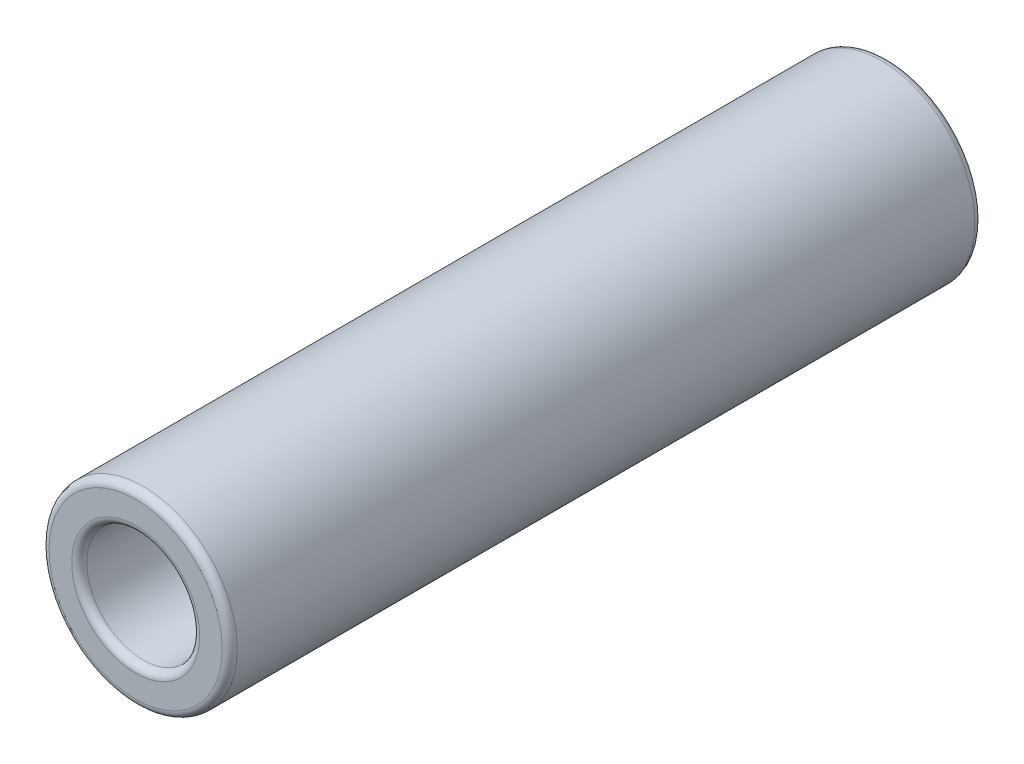
ISO-10303-21;
HEADER;
FILE_DESCRIPTION(('STEP AP214'),'2;1');
FILE_NAME('part.step','',(''),(''),'','','');
FILE_SCHEMA(('AUTOMOTIVE_DESIGN { 1 0 10303 214 1 1 1 1 }'));
ENDSEC;
DATA;
#1=APPLICATION_CONTEXT('core data for automotive mechanical design processes');
#2=APPLICATION_PROTOCOL_DEFINITION('international standard','automotive_design',2000,#1);
#3=PRODUCT_CONTEXT('',#1,'mechanical');
#4=PRODUCT('Part','Part','',(#3));
#5=PRODUCT_RELATED_PRODUCT_CATEGORY('part','',(#4));
#6=PRODUCT_DEFINITION_FORMATION('','',#4);
#7=PRODUCT_DEFINITION_CONTEXT('part definition',#1,'design');
#8=PRODUCT_DEFINITION('design','',#6,#7);
#9=PRODUCT_DEFINITION_SHAPE('','',#8);
#10=(LENGTH_UNIT() NAMED_UNIT(*) SI_UNIT(.MILLI.,.METRE.));
#11=(NAMED_UNIT(*) PLANE_ANGLE_UNIT() SI_UNIT($,.RADIAN.));
#12=(NAMED_UNIT(*) SI_UNIT($,.STERADIAN.) SOLID_ANGLE_UNIT());
#13=UNCERTAINTY_MEASURE_WITH_UNIT(LENGTH_MEASURE(1.E-05),#10,'distance_accuracy_value','');
#14=(GEOMETRIC_REPRESENTATION_CONTEXT(3) GLOBAL_UNCERTAINTY_ASSIGNED_CONTEXT((#13)) GLOBAL_UNIT_ASSIGNED_CONTEXT((#10,
#11,#12)) REPRESENTATION_CONTEXT('',''));
#15=CARTESIAN_POINT('',(0.,0.,0.));
#16=DIRECTION('',(0.,0.,1.));
#17=DIRECTION('',(1.,0.,0.));
#18=AXIS2_PLACEMENT_3D('',#15,#16,#17);
#19=CARTESIAN_POINT('',(0.,0.,50.));
#20=DIRECTION('',(0.,0.,1.));
#21=DIRECTION('',(1.,0.,0.));
#22=AXIS2_PLACEMENT_3D('',#19,#20,#21);
#23=PLANE('',#22);
#24=CARTESIAN_POINT('',(0.,0.,50.));
#25=DIRECTION('',(0.,0.,1.));
#26=DIRECTION('',(1.,0.,0.));
#27=AXIS2_PLACEMENT_3D('',#24,#25,#26);
#28=CIRCLE('',#27,4.25);
#29=CARTESIAN_POINT('',(4.25,0.,50.));
#30=VERTEX_POINT('',#29);
#31=EDGE_CURVE('E57',#30,#30,#28,.F.);
#32=ORIENTED_EDGE('',*,*,#31,.T.);
#33=EDGE_LOOP('',(#32));
#34=FACE_BOUND('',#33,.T.);
#35=CARTESIAN_POINT('',(0.,0.,50.));
#36=DIRECTION('',(0.,0.,1.));
#37=DIRECTION('',(1.,0.,0.));
#38=AXIS2_PLACEMENT_3D('',#35,#36,#37);
#39=CIRCLE('',#38,5.75);
#40=CARTESIAN_POINT('',(5.75,0.,50.));
#41=VERTEX_POINT('',#40);
#42=EDGE_CURVE('E60',#41,#41,#39,.T.);
#43=ORIENTED_EDGE('',*,*,#42,.T.);
#44=EDGE_LOOP('',(#43));
#45=FACE_BOUND('',#44,.T.);
#46=ADVANCED_FACE('F37',(#34,#45),#23,.T.);
#47=CARTESIAN_POINT('',(0.,0.,0.));
#48=DIRECTION('',(0.,0.,1.));
#49=DIRECTION('',(1.,0.,0.));
#50=AXIS2_PLACEMENT_3D('',#47,#48,#49);
#51=PLANE('',#50);
#52=CARTESIAN_POINT('',(0.,0.,0.));
#53=DIRECTION('',(0.,0.,1.));
#54=DIRECTION('',(1.,0.,0.));
#55=AXIS2_PLACEMENT_3D('',#52,#53,#54);
#56=CIRCLE('',#55,4.25);
#57=CARTESIAN_POINT('',(4.25,0.,0.));
#58=VERTEX_POINT('',#57);
#59=EDGE_CURVE('E10',#58,#58,#56,.T.);
#60=ORIENTED_EDGE('',*,*,#59,.T.);
#61=EDGE_LOOP('',(#60));
#62=FACE_BOUND('',#61,.T.);
#63=CARTESIAN_POINT('',(0.,0.,0.));
#64=DIRECTION('',(0.,0.,1.));
#65=DIRECTION('',(1.,0.,0.));
#66=AXIS2_PLACEMENT_3D('',#63,#64,#65);
#67=CIRCLE('',#66,5.75);
#68=CARTESIAN_POINT('',(5.75,0.,0.));
#69=VERTEX_POINT('',#68);
#70=EDGE_CURVE('E44',#69,#69,#67,.F.);
#71=ORIENTED_EDGE('',*,*,#70,.T.);
#72=EDGE_LOOP('',(#71));
#73=FACE_BOUND('',#72,.T.);
#74=ADVANCED_FACE('F85',(#62,#73),#51,.F.);
#75=CARTESIAN_POINT('',(0.,0.,50.));
#76=DIRECTION('',(0.,0.,-1.));
#77=DIRECTION('',(-1.,0.,0.));
#78=AXIS2_PLACEMENT_3D('',#75,#76,#77);
#79=CYLINDRICAL_SURFACE('',#78,6.25);
#80=CARTESIAN_POINT('',(0.,0.,49.5));
#81=DIRECTION('',(0.,0.,1.));
#82=DIRECTION('',(1.,0.,0.));
#83=AXIS2_PLACEMENT_3D('',#80,#81,#82);
#84=CIRCLE('',#83,6.25);
#85=CARTESIAN_POINT('',(6.25,0.,49.5));
#86=VERTEX_POINT('',#85);
#87=EDGE_CURVE('E48',#86,#86,#84,.F.);
#88=ORIENTED_EDGE('',*,*,#87,.T.);
#89=EDGE_LOOP('',(#88));
#90=FACE_BOUND('',#89,.T.);
#91=CARTESIAN_POINT('',(0.,0.,0.5));
#92=DIRECTION('',(0.,0.,1.));
#93=DIRECTION('',(1.,0.,0.));
#94=AXIS2_PLACEMENT_3D('',#91,#92,#93);
#95=CIRCLE('',#94,6.25);
#96=CARTESIAN_POINT('',(6.25,0.,0.5));
#97=VERTEX_POINT('',#96);
#98=EDGE_CURVE('E52',#97,#97,#95,.T.);
#99=ORIENTED_EDGE('',*,*,#98,.T.);
#100=EDGE_LOOP('',(#99));
#101=FACE_BOUND('',#100,.T.);
#102=ADVANCED_FACE('F91',(#90,#101),#79,.T.);
#103=CARTESIAN_POINT('',(0.,0.,50.));
#104=DIRECTION('',(0.,0.,-1.));
#105=DIRECTION('',(-1.,0.,0.));
#106=AXIS2_PLACEMENT_3D('',#103,#104,#105);
#107=CYLINDRICAL_SURFACE('',#106,3.75);
#108=CARTESIAN_POINT('',(0.,0.,49.5));
#109=DIRECTION('',(0.,0.,1.));
#110=DIRECTION('',(1.,0.,0.));
#111=AXIS2_PLACEMENT_3D('',#108,#109,#110);
#112=CIRCLE('',#111,3.75);
#113=CARTESIAN_POINT('',(3.75,0.,49.5));
#114=VERTEX_POINT('',#113);
#115=EDGE_CURVE('E63',#114,#114,#112,.T.);
#116=ORIENTED_EDGE('',*,*,#115,.T.);
#117=EDGE_LOOP('',(#116));
#118=FACE_BOUND('',#117,.T.);
#119=CARTESIAN_POINT('',(0.,0.,0.5));
#120=DIRECTION('',(0.,0.,1.));
#121=DIRECTION('',(1.,0.,0.));
#122=AXIS2_PLACEMENT_3D('',#119,#120,#121);
#123=CIRCLE('',#122,3.75);
#124=CARTESIAN_POINT('',(3.75,0.,0.5));
#125=VERTEX_POINT('',#124);
#126=EDGE_CURVE('E66',#125,#125,#123,.F.);
#127=ORIENTED_EDGE('',*,*,#126,.T.);
#128=EDGE_LOOP('',(#127));
#129=FACE_BOUND('',#128,.T.);
#130=ADVANCED_FACE('F70',(#118,#129),#107,.F.);
#131=CARTESIAN_POINT('',(0.,0.,49.5));
#132=DIRECTION('',(0.,0.,1.));
#133=DIRECTION('',(1.,0.,0.));
#134=AXIS2_PLACEMENT_3D('',#131,#132,#133);
#135=TOROIDAL_SURFACE('',#134,4.25,0.5);
#136=ORIENTED_EDGE('',*,*,#31,.F.);
#137=EDGE_LOOP('',(#136));
#138=FACE_BOUND('',#137,.T.);
#139=ORIENTED_EDGE('',*,*,#115,.F.);
#140=EDGE_LOOP('',(#139));
#141=FACE_BOUND('',#140,.T.);
#142=ADVANCED_FACE('F81',(#138,#141),#135,.T.);
#143=CARTESIAN_POINT('',(0.,0.,49.5));
#144=DIRECTION('',(0.,0.,1.));
#145=DIRECTION('',(1.,0.,0.));
#146=AXIS2_PLACEMENT_3D('',#143,#144,#145);
#147=TOROIDAL_SURFACE('',#146,5.75,0.5);
#148=ORIENTED_EDGE('',*,*,#87,.F.);
#149=EDGE_LOOP('',(#148));
#150=FACE_BOUND('',#149,.T.);
#151=ORIENTED_EDGE('',*,*,#42,.F.);
#152=EDGE_LOOP('',(#151));
#153=FACE_BOUND('',#152,.T.);
#154=ADVANCED_FACE('F75',(#150,#153),#147,.T.);
#155=CARTESIAN_POINT('',(0.,0.,0.5));
#156=DIRECTION('',(0.,0.,1.));
#157=DIRECTION('',(1.,0.,0.));
#158=AXIS2_PLACEMENT_3D('',#155,#156,#157);
#159=TOROIDAL_SURFACE('',#158,4.25,0.5);
#160=ORIENTED_EDGE('',*,*,#126,.F.);
#161=EDGE_LOOP('',(#160));
#162=FACE_BOUND('',#161,.T.);
#163=ORIENTED_EDGE('',*,*,#59,.F.);
#164=EDGE_LOOP('',(#163));
#165=FACE_BOUND('',#164,.T.);
#166=ADVANCED_FACE('F72',(#162,#165),#159,.T.);
#167=CARTESIAN_POINT('',(0.,0.,0.5));
#168=DIRECTION('',(0.,0.,1.));
#169=DIRECTION('',(1.,0.,0.));
#170=AXIS2_PLACEMENT_3D('',#167,#168,#169);
#171=TOROIDAL_SURFACE('',#170,5.75,0.5);
#172=ORIENTED_EDGE('',*,*,#70,.F.);
#173=EDGE_LOOP('',(#172));
#174=FACE_BOUND('',#173,.T.);
#175=ORIENTED_EDGE('',*,*,#98,.F.);
#176=EDGE_LOOP('',(#175));
#177=FACE_BOUND('',#176,.T.);
#178=ADVANCED_FACE('F39',(#174,#177),#171,.T.);
#179=CLOSED_SHELL('',(#46,#74,#102,#130,#142,#154,#166,#178));
#180=MANIFOLD_SOLID_BREP('B2',#179);
#181=ADVANCED_BREP_SHAPE_REPRESENTATION('',(#18,#180),#14);
#182=SHAPE_DEFINITION_REPRESENTATION(#9,#181);
ENDSEC;
END-ISO-10303-21;
